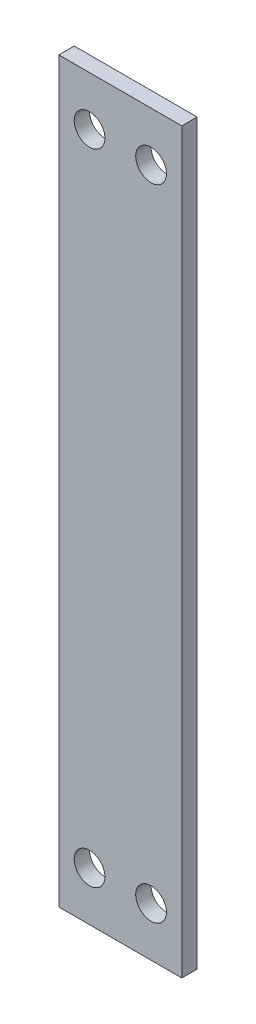
ISO-10303-21;
HEADER;
FILE_DESCRIPTION(('STEP AP214'),'2;1');
FILE_NAME('part.step','',(''),(''),'','','');
FILE_SCHEMA(('AUTOMOTIVE_DESIGN { 1 0 10303 214 1 1 1 1 }'));
ENDSEC;
DATA;
#1=APPLICATION_CONTEXT('core data for automotive mechanical design processes');
#2=APPLICATION_PROTOCOL_DEFINITION('international standard','automotive_design',2000,#1);
#3=PRODUCT_CONTEXT('',#1,'mechanical');
#4=PRODUCT('Part','Part','',(#3));
#5=PRODUCT_RELATED_PRODUCT_CATEGORY('part','',(#4));
#6=PRODUCT_DEFINITION_FORMATION('','',#4);
#7=PRODUCT_DEFINITION_CONTEXT('part definition',#1,'design');
#8=PRODUCT_DEFINITION('design','',#6,#7);
#9=PRODUCT_DEFINITION_SHAPE('','',#8);
#10=(LENGTH_UNIT() NAMED_UNIT(*) SI_UNIT(.MILLI.,.METRE.));
#11=(NAMED_UNIT(*) PLANE_ANGLE_UNIT() SI_UNIT($,.RADIAN.));
#12=(NAMED_UNIT(*) SI_UNIT($,.STERADIAN.) SOLID_ANGLE_UNIT());
#13=UNCERTAINTY_MEASURE_WITH_UNIT(LENGTH_MEASURE(1.E-05),#10,'distance_accuracy_value','');
#14=(GEOMETRIC_REPRESENTATION_CONTEXT(3) GLOBAL_UNCERTAINTY_ASSIGNED_CONTEXT((#13)) GLOBAL_UNIT_ASSIGNED_CONTEXT((#10,
#11,#12)) REPRESENTATION_CONTEXT('',''));
#15=CARTESIAN_POINT('',(0.,0.,0.));
#16=DIRECTION('',(0.,0.,1.));
#17=DIRECTION('',(1.,0.,0.));
#18=AXIS2_PLACEMENT_3D('',#15,#16,#17);
#19=CARTESIAN_POINT('',(0.,0.,4.7625));
#20=DIRECTION('',(0.,0.,-1.));
#21=DIRECTION('',(-1.,0.,0.));
#22=AXIS2_PLACEMENT_3D('',#19,#20,#21);
#23=PLANE('',#22);
#24=DIRECTION('',(0.,-1.,0.));
#25=VECTOR('',#24,1.);
#26=CARTESIAN_POINT('',(0.,0.,4.7625));
#27=LINE('',#26,#25);
#28=CARTESIAN_POINT('',(0.,228.6,4.7625));
#29=VERTEX_POINT('',#28);
#30=CARTESIAN_POINT('',(0.,0.,4.7625));
#31=VERTEX_POINT('',#30);
#32=EDGE_CURVE('E96',#29,#31,#27,.T.);
#33=ORIENTED_EDGE('',*,*,#32,.T.);
#34=DIRECTION('',(1.,0.,0.));
#35=VECTOR('',#34,1.);
#36=CARTESIAN_POINT('',(0.,0.,4.7625));
#37=LINE('',#36,#35);
#38=CARTESIAN_POINT('',(38.1,0.,4.7625));
#39=VERTEX_POINT('',#38);
#40=EDGE_CURVE('E91',#31,#39,#37,.T.);
#41=ORIENTED_EDGE('',*,*,#40,.T.);
#42=DIRECTION('',(0.,1.,0.));
#43=VECTOR('',#42,1.);
#44=CARTESIAN_POINT('',(38.1,0.,4.7625));
#45=LINE('',#44,#43);
#46=CARTESIAN_POINT('',(38.1,228.6,4.7625));
#47=VERTEX_POINT('',#46);
#48=EDGE_CURVE('E94',#39,#47,#45,.T.);
#49=ORIENTED_EDGE('',*,*,#48,.T.);
#50=DIRECTION('',(-1.,0.,0.));
#51=VECTOR('',#50,1.);
#52=CARTESIAN_POINT('',(0.,228.6,4.7625));
#53=LINE('',#52,#51);
#54=EDGE_CURVE('E61',#47,#29,#53,.T.);
#55=ORIENTED_EDGE('',*,*,#54,.T.);
#56=EDGE_LOOP('',(#33,#41,#49,#55));
#57=FACE_BOUND('',#56,.T.);
#58=CARTESIAN_POINT('',(9.525,15.24,4.7625));
#59=DIRECTION('',(0.,0.,1.));
#60=DIRECTION('',(1.,0.,0.));
#61=AXIS2_PLACEMENT_3D('',#58,#59,#60);
#62=CIRCLE('',#61,4.7625);
#63=CARTESIAN_POINT('',(4.7625,15.24,4.7625));
#64=VERTEX_POINT('',#63);
#65=EDGE_CURVE('E116',#64,#64,#62,.T.);
#66=ORIENTED_EDGE('',*,*,#65,.F.);
#67=EDGE_LOOP('',(#66));
#68=FACE_BOUND('',#67,.T.);
#69=CARTESIAN_POINT('',(28.575,15.24,4.7625));
#70=DIRECTION('',(0.,0.,1.));
#71=DIRECTION('',(1.,0.,0.));
#72=AXIS2_PLACEMENT_3D('',#69,#70,#71);
#73=CIRCLE('',#72,4.7625);
#74=CARTESIAN_POINT('',(23.8125,15.24,4.7625));
#75=VERTEX_POINT('',#74);
#76=EDGE_CURVE('E138',#75,#75,#73,.T.);
#77=ORIENTED_EDGE('',*,*,#76,.F.);
#78=EDGE_LOOP('',(#77));
#79=FACE_BOUND('',#78,.T.);
#80=CARTESIAN_POINT('',(9.525,213.36,4.7625));
#81=DIRECTION('',(0.,0.,1.));
#82=DIRECTION('',(1.,0.,0.));
#83=AXIS2_PLACEMENT_3D('',#80,#81,#82);
#84=CIRCLE('',#83,4.7625);
#85=CARTESIAN_POINT('',(4.76250000000001,213.36,4.7625));
#86=VERTEX_POINT('',#85);
#87=EDGE_CURVE('E146',#86,#86,#84,.T.);
#88=ORIENTED_EDGE('',*,*,#87,.F.);
#89=EDGE_LOOP('',(#88));
#90=FACE_BOUND('',#89,.T.);
#91=CARTESIAN_POINT('',(28.575,213.36,4.7625));
#92=DIRECTION('',(0.,0.,1.));
#93=DIRECTION('',(1.,0.,0.));
#94=AXIS2_PLACEMENT_3D('',#91,#92,#93);
#95=CIRCLE('',#94,4.7625);
#96=CARTESIAN_POINT('',(23.8125,213.36,4.7625));
#97=VERTEX_POINT('',#96);
#98=EDGE_CURVE('E154',#97,#97,#95,.T.);
#99=ORIENTED_EDGE('',*,*,#98,.F.);
#100=EDGE_LOOP('',(#99));
#101=FACE_BOUND('',#100,.T.);
#102=ADVANCED_FACE('F43',(#57,#68,#79,#90,#101),#23,.F.);
#103=CARTESIAN_POINT('',(0.,0.,0.));
#104=DIRECTION('',(0.,0.,-1.));
#105=DIRECTION('',(-1.,0.,0.));
#106=AXIS2_PLACEMENT_3D('',#103,#104,#105);
#107=PLANE('',#106);
#108=CARTESIAN_POINT('',(9.525,213.36,0.));
#109=DIRECTION('',(0.,0.,1.));
#110=DIRECTION('',(1.,0.,0.));
#111=AXIS2_PLACEMENT_3D('',#108,#109,#110);
#112=CIRCLE('',#111,4.7625);
#113=CARTESIAN_POINT('',(4.76250000000001,213.36,0.));
#114=VERTEX_POINT('',#113);
#115=EDGE_CURVE('E150',#114,#114,#112,.T.);
#116=ORIENTED_EDGE('',*,*,#115,.T.);
#117=EDGE_LOOP('',(#116));
#118=FACE_BOUND('',#117,.T.);
#119=CARTESIAN_POINT('',(9.525,15.24,0.));
#120=DIRECTION('',(0.,0.,1.));
#121=DIRECTION('',(1.,0.,0.));
#122=AXIS2_PLACEMENT_3D('',#119,#120,#121);
#123=CIRCLE('',#122,4.7625);
#124=CARTESIAN_POINT('',(4.7625,15.24,0.));
#125=VERTEX_POINT('',#124);
#126=EDGE_CURVE('E134',#125,#125,#123,.T.);
#127=ORIENTED_EDGE('',*,*,#126,.T.);
#128=EDGE_LOOP('',(#127));
#129=FACE_BOUND('',#128,.T.);
#130=DIRECTION('',(0.,-1.,0.));
#131=VECTOR('',#130,1.);
#132=CARTESIAN_POINT('',(0.,0.,0.));
#133=LINE('',#132,#131);
#134=CARTESIAN_POINT('',(0.,228.6,0.));
#135=VERTEX_POINT('',#134);
#136=CARTESIAN_POINT('',(0.,0.,0.));
#137=VERTEX_POINT('',#136);
#138=EDGE_CURVE('E112',#135,#137,#133,.T.);
#139=ORIENTED_EDGE('',*,*,#138,.F.);
#140=DIRECTION('',(-1.,0.,0.));
#141=VECTOR('',#140,1.);
#142=CARTESIAN_POINT('',(0.,228.6,0.));
#143=LINE('',#142,#141);
#144=CARTESIAN_POINT('',(38.1,228.6,0.));
#145=VERTEX_POINT('',#144);
#146=EDGE_CURVE('E84',#145,#135,#143,.T.);
#147=ORIENTED_EDGE('',*,*,#146,.F.);
#148=DIRECTION('',(0.,1.,0.));
#149=VECTOR('',#148,1.);
#150=CARTESIAN_POINT('',(38.1,0.,0.));
#151=LINE('',#150,#149);
#152=CARTESIAN_POINT('',(38.1,0.,0.));
#153=VERTEX_POINT('',#152);
#154=EDGE_CURVE('E78',#153,#145,#151,.T.);
#155=ORIENTED_EDGE('',*,*,#154,.F.);
#156=DIRECTION('',(1.,0.,0.));
#157=VECTOR('',#156,1.);
#158=CARTESIAN_POINT('',(0.,0.,0.));
#159=LINE('',#158,#157);
#160=EDGE_CURVE('E101',#137,#153,#159,.T.);
#161=ORIENTED_EDGE('',*,*,#160,.F.);
#162=EDGE_LOOP('',(#139,#147,#155,#161));
#163=FACE_BOUND('',#162,.T.);
#164=CARTESIAN_POINT('',(28.575,15.24,0.));
#165=DIRECTION('',(0.,0.,1.));
#166=DIRECTION('',(1.,0.,0.));
#167=AXIS2_PLACEMENT_3D('',#164,#165,#166);
#168=CIRCLE('',#167,4.7625);
#169=CARTESIAN_POINT('',(23.8125,15.24,0.));
#170=VERTEX_POINT('',#169);
#171=EDGE_CURVE('E142',#170,#170,#168,.T.);
#172=ORIENTED_EDGE('',*,*,#171,.T.);
#173=EDGE_LOOP('',(#172));
#174=FACE_BOUND('',#173,.T.);
#175=CARTESIAN_POINT('',(28.575,213.36,0.));
#176=DIRECTION('',(0.,0.,1.));
#177=DIRECTION('',(1.,0.,0.));
#178=AXIS2_PLACEMENT_3D('',#175,#176,#177);
#179=CIRCLE('',#178,4.7625);
#180=CARTESIAN_POINT('',(23.8125,213.36,0.));
#181=VERTEX_POINT('',#180);
#182=EDGE_CURVE('E158',#181,#181,#179,.T.);
#183=ORIENTED_EDGE('',*,*,#182,.T.);
#184=EDGE_LOOP('',(#183));
#185=FACE_BOUND('',#184,.T.);
#186=ADVANCED_FACE('F129',(#118,#129,#163,#174,#185),#107,.T.);
#187=CARTESIAN_POINT('',(0.,0.,4.7625));
#188=DIRECTION('',(1.,0.,0.));
#189=DIRECTION('',(0.,0.,-1.));
#190=AXIS2_PLACEMENT_3D('',#187,#188,#189);
#191=PLANE('',#190);
#192=ORIENTED_EDGE('',*,*,#138,.T.);
#193=DIRECTION('',(0.,0.,-1.));
#194=VECTOR('',#193,1.);
#195=CARTESIAN_POINT('',(0.,0.,4.7625));
#196=LINE('',#195,#194);
#197=EDGE_CURVE('E11',#31,#137,#196,.T.);
#198=ORIENTED_EDGE('',*,*,#197,.F.);
#199=ORIENTED_EDGE('',*,*,#32,.F.);
#200=DIRECTION('',(0.,0.,-1.));
#201=VECTOR('',#200,1.);
#202=CARTESIAN_POINT('',(0.,228.6,4.7625));
#203=LINE('',#202,#201);
#204=EDGE_CURVE('E108',#29,#135,#203,.T.);
#205=ORIENTED_EDGE('',*,*,#204,.T.);
#206=EDGE_LOOP('',(#192,#198,#199,#205));
#207=FACE_BOUND('',#206,.T.);
#208=ADVANCED_FACE('F45',(#207),#191,.F.);
#209=CARTESIAN_POINT('',(0.,0.,4.7625));
#210=DIRECTION('',(0.,1.,0.));
#211=DIRECTION('',(0.,0.,1.));
#212=AXIS2_PLACEMENT_3D('',#209,#210,#211);
#213=PLANE('',#212);
#214=ORIENTED_EDGE('',*,*,#160,.T.);
#215=DIRECTION('',(0.,0.,-1.));
#216=VECTOR('',#215,1.);
#217=CARTESIAN_POINT('',(38.1,0.,4.7625));
#218=LINE('',#217,#216);
#219=EDGE_CURVE('E53',#39,#153,#218,.T.);
#220=ORIENTED_EDGE('',*,*,#219,.F.);
#221=ORIENTED_EDGE('',*,*,#40,.F.);
#222=ORIENTED_EDGE('',*,*,#197,.T.);
#223=EDGE_LOOP('',(#214,#220,#221,#222));
#224=FACE_BOUND('',#223,.T.);
#225=ADVANCED_FACE('F100',(#224),#213,.F.);
#226=CARTESIAN_POINT('',(38.1,0.,4.7625));
#227=DIRECTION('',(-1.,0.,0.));
#228=DIRECTION('',(0.,0.,1.));
#229=AXIS2_PLACEMENT_3D('',#226,#227,#228);
#230=PLANE('',#229);
#231=ORIENTED_EDGE('',*,*,#154,.T.);
#232=DIRECTION('',(0.,0.,-1.));
#233=VECTOR('',#232,1.);
#234=CARTESIAN_POINT('',(38.1,228.6,4.7625));
#235=LINE('',#234,#233);
#236=EDGE_CURVE('E103',#47,#145,#235,.T.);
#237=ORIENTED_EDGE('',*,*,#236,.F.);
#238=ORIENTED_EDGE('',*,*,#48,.F.);
#239=ORIENTED_EDGE('',*,*,#219,.T.);
#240=EDGE_LOOP('',(#231,#237,#238,#239));
#241=FACE_BOUND('',#240,.T.);
#242=ADVANCED_FACE('F104',(#241),#230,.F.);
#243=CARTESIAN_POINT('',(0.,228.6,4.7625));
#244=DIRECTION('',(0.,-1.,0.));
#245=DIRECTION('',(0.,0.,-1.));
#246=AXIS2_PLACEMENT_3D('',#243,#244,#245);
#247=PLANE('',#246);
#248=ORIENTED_EDGE('',*,*,#146,.T.);
#249=ORIENTED_EDGE('',*,*,#204,.F.);
#250=ORIENTED_EDGE('',*,*,#54,.F.);
#251=ORIENTED_EDGE('',*,*,#236,.T.);
#252=EDGE_LOOP('',(#248,#249,#250,#251));
#253=FACE_BOUND('',#252,.T.);
#254=ADVANCED_FACE('F126',(#253),#247,.F.);
#255=CARTESIAN_POINT('',(9.525,15.24,4.7625));
#256=DIRECTION('',(0.,0.,-1.));
#257=DIRECTION('',(-1.,0.,0.));
#258=AXIS2_PLACEMENT_3D('',#255,#256,#257);
#259=CYLINDRICAL_SURFACE('',#258,4.7625);
#260=CARTESIAN_POINT('',(4.7625,15.24,4.7625));
#261=CARTESIAN_POINT('',(4.7625,15.24,4.712890625));
#262=CARTESIAN_POINT('',(4.7625,15.24,4.66328125));
#263=CARTESIAN_POINT('',(4.7625,15.24,4.5640625));
#264=CARTESIAN_POINT('',(4.7625,15.24,4.514453125));
#265=CARTESIAN_POINT('',(4.7625,15.24,4.415234375));
#266=CARTESIAN_POINT('',(4.7625,15.24,4.365625));
#267=CARTESIAN_POINT('',(4.7625,15.24,4.26640625));
#268=CARTESIAN_POINT('',(4.7625,15.24,4.216796875));
#269=CARTESIAN_POINT('',(4.7625,15.24,4.117578125));
#270=CARTESIAN_POINT('',(4.7625,15.24,4.06796875));
#271=CARTESIAN_POINT('',(4.7625,15.24,3.96875));
#272=CARTESIAN_POINT('',(4.7625,15.24,3.919140625));
#273=CARTESIAN_POINT('',(4.7625,15.24,3.819921875));
#274=CARTESIAN_POINT('',(4.7625,15.24,3.7703125));
#275=CARTESIAN_POINT('',(4.7625,15.24,3.67109375));
#276=CARTESIAN_POINT('',(4.7625,15.24,3.621484375));
#277=CARTESIAN_POINT('',(4.7625,15.24,3.522265625));
#278=CARTESIAN_POINT('',(4.7625,15.24,3.47265625));
#279=CARTESIAN_POINT('',(4.7625,15.24,3.3734375));
#280=CARTESIAN_POINT('',(4.7625,15.24,3.323828125));
#281=CARTESIAN_POINT('',(4.7625,15.24,3.224609375));
#282=CARTESIAN_POINT('',(4.7625,15.24,3.175));
#283=CARTESIAN_POINT('',(4.7625,15.24,3.07578125));
#284=CARTESIAN_POINT('',(4.7625,15.24,3.026171875));
#285=CARTESIAN_POINT('',(4.7625,15.24,2.926953125));
#286=CARTESIAN_POINT('',(4.7625,15.24,2.87734375));
#287=CARTESIAN_POINT('',(4.7625,15.24,2.778125));
#288=CARTESIAN_POINT('',(4.7625,15.24,2.728515625));
#289=CARTESIAN_POINT('',(4.7625,15.24,2.629296875));
#290=CARTESIAN_POINT('',(4.7625,15.24,2.5796875));
#291=CARTESIAN_POINT('',(4.7625,15.24,2.48046875));
#292=CARTESIAN_POINT('',(4.7625,15.24,2.430859375));
#293=CARTESIAN_POINT('',(4.7625,15.24,2.331640625));
#294=CARTESIAN_POINT('',(4.7625,15.24,2.28203125));
#295=CARTESIAN_POINT('',(4.7625,15.24,2.1828125));
#296=CARTESIAN_POINT('',(4.7625,15.24,2.133203125));
#297=CARTESIAN_POINT('',(4.7625,15.24,2.033984375));
#298=CARTESIAN_POINT('',(4.7625,15.24,1.984375));
#299=CARTESIAN_POINT('',(4.7625,15.24,1.88515625));
#300=CARTESIAN_POINT('',(4.7625,15.24,1.835546875));
#301=CARTESIAN_POINT('',(4.7625,15.24,1.736328125));
#302=CARTESIAN_POINT('',(4.7625,15.24,1.68671875));
#303=CARTESIAN_POINT('',(4.7625,15.24,1.5875));
#304=CARTESIAN_POINT('',(4.7625,15.24,1.537890625));
#305=CARTESIAN_POINT('',(4.7625,15.24,1.438671875));
#306=CARTESIAN_POINT('',(4.7625,15.24,1.3890625));
#307=CARTESIAN_POINT('',(4.7625,15.24,1.28984375));
#308=CARTESIAN_POINT('',(4.7625,15.24,1.240234375));
#309=CARTESIAN_POINT('',(4.7625,15.24,1.141015625));
#310=CARTESIAN_POINT('',(4.7625,15.24,1.09140625));
#311=CARTESIAN_POINT('',(4.7625,15.24,0.992187499999999));
#312=CARTESIAN_POINT('',(4.7625,15.24,0.942578124999999));
#313=CARTESIAN_POINT('',(4.7625,15.24,0.843359375));
#314=CARTESIAN_POINT('',(4.7625,15.24,0.79375));
#315=CARTESIAN_POINT('',(4.7625,15.24,0.69453125));
#316=CARTESIAN_POINT('',(4.7625,15.24,0.644921875));
#317=CARTESIAN_POINT('',(4.7625,15.24,0.545703125));
#318=CARTESIAN_POINT('',(4.7625,15.24,0.49609375));
#319=CARTESIAN_POINT('',(4.7625,15.24,0.396875));
#320=CARTESIAN_POINT('',(4.7625,15.24,0.347265625));
#321=CARTESIAN_POINT('',(4.7625,15.24,0.248046875));
#322=CARTESIAN_POINT('',(4.7625,15.24,0.1984375));
#323=CARTESIAN_POINT('',(4.7625,15.24,0.09921875));
#324=CARTESIAN_POINT('',(4.7625,15.24,0.049609375));
#325=CARTESIAN_POINT('',(4.7625,15.24,0.));
#326=B_SPLINE_CURVE_WITH_KNOTS('',3,(#260,#261,#262,#263,#264,#265,#266,#267,#268,#269,#270,
#271,#272,#273,#274,#275,#276,#277,#278,#279,#280,#281,#282,#283,#284,#285,#286,#287,#288,#289,
#290,#291,#292,#293,#294,#295,#296,#297,#298,#299,#300,#301,#302,#303,#304,#305,#306,#307,#308,
#309,#310,#311,#312,#313,#314,#315,#316,#317,#318,#319,#320,#321,#322,#323,#324,#325),
.UNSPECIFIED.,.F.,.F.,(4,2,2,2,2,2,2,2,2,2,2,2,2,2,2,2,2,2,2,2,2,2,2,2,2,2,2,2,2,2,2,2,4),(0.,
0.148828125,0.29765625,0.446484375,0.5953125,0.744140625,0.892968750000001,1.041796875,1.190625,
1.339453125,1.48828125,1.637109375,1.7859375,1.934765625,2.08359375,2.232421875,2.38125,
2.530078125,2.67890625,2.827734375,2.9765625,3.125390625,3.27421875,3.423046875,3.571875,
3.720703125,3.86953125,4.018359375,4.1671875,4.316015625,4.46484375,4.613671875,4.7625),.UNSPECIFIED.);
#327=EDGE_CURVE('BSEAM177',#64,#125,#326,.T.);
#328=ORIENTED_EDGE('',*,*,#65,.T.);
#329=ORIENTED_EDGE('',*,*,#126,.F.);
#330=ORIENTED_EDGE('',*,*,#327,.T.);
#331=ORIENTED_EDGE('',*,*,#327,.F.);
#332=EDGE_LOOP('',(#328,#330,#329,#331));
#333=FACE_BOUND('',#332,.T.);
#334=ADVANCED_FACE('F177',(#333),#259,.F.);
#335=CARTESIAN_POINT('',(28.575,15.24,4.7625));
#336=DIRECTION('',(0.,0.,-1.));
#337=DIRECTION('',(-1.,0.,0.));
#338=AXIS2_PLACEMENT_3D('',#335,#336,#337);
#339=CYLINDRICAL_SURFACE('',#338,4.7625);
#340=CARTESIAN_POINT('',(23.8125,15.24,4.7625));
#341=CARTESIAN_POINT('',(23.8125,15.24,4.712890625));
#342=CARTESIAN_POINT('',(23.8125,15.24,4.66328125));
#343=CARTESIAN_POINT('',(23.8125,15.24,4.5640625));
#344=CARTESIAN_POINT('',(23.8125,15.24,4.514453125));
#345=CARTESIAN_POINT('',(23.8125,15.24,4.415234375));
#346=CARTESIAN_POINT('',(23.8125,15.24,4.365625));
#347=CARTESIAN_POINT('',(23.8125,15.24,4.26640625));
#348=CARTESIAN_POINT('',(23.8125,15.24,4.216796875));
#349=CARTESIAN_POINT('',(23.8125,15.24,4.117578125));
#350=CARTESIAN_POINT('',(23.8125,15.24,4.06796875));
#351=CARTESIAN_POINT('',(23.8125,15.24,3.96875));
#352=CARTESIAN_POINT('',(23.8125,15.24,3.919140625));
#353=CARTESIAN_POINT('',(23.8125,15.24,3.819921875));
#354=CARTESIAN_POINT('',(23.8125,15.24,3.7703125));
#355=CARTESIAN_POINT('',(23.8125,15.24,3.67109375));
#356=CARTESIAN_POINT('',(23.8125,15.24,3.621484375));
#357=CARTESIAN_POINT('',(23.8125,15.24,3.522265625));
#358=CARTESIAN_POINT('',(23.8125,15.24,3.47265625));
#359=CARTESIAN_POINT('',(23.8125,15.24,3.3734375));
#360=CARTESIAN_POINT('',(23.8125,15.24,3.323828125));
#361=CARTESIAN_POINT('',(23.8125,15.24,3.224609375));
#362=CARTESIAN_POINT('',(23.8125,15.24,3.175));
#363=CARTESIAN_POINT('',(23.8125,15.24,3.07578125));
#364=CARTESIAN_POINT('',(23.8125,15.24,3.026171875));
#365=CARTESIAN_POINT('',(23.8125,15.24,2.926953125));
#366=CARTESIAN_POINT('',(23.8125,15.24,2.87734375));
#367=CARTESIAN_POINT('',(23.8125,15.24,2.778125));
#368=CARTESIAN_POINT('',(23.8125,15.24,2.728515625));
#369=CARTESIAN_POINT('',(23.8125,15.24,2.629296875));
#370=CARTESIAN_POINT('',(23.8125,15.24,2.5796875));
#371=CARTESIAN_POINT('',(23.8125,15.24,2.48046875));
#372=CARTESIAN_POINT('',(23.8125,15.24,2.430859375));
#373=CARTESIAN_POINT('',(23.8125,15.24,2.331640625));
#374=CARTESIAN_POINT('',(23.8125,15.24,2.28203125));
#375=CARTESIAN_POINT('',(23.8125,15.24,2.1828125));
#376=CARTESIAN_POINT('',(23.8125,15.24,2.133203125));
#377=CARTESIAN_POINT('',(23.8125,15.24,2.033984375));
#378=CARTESIAN_POINT('',(23.8125,15.24,1.984375));
#379=CARTESIAN_POINT('',(23.8125,15.24,1.88515625));
#380=CARTESIAN_POINT('',(23.8125,15.24,1.835546875));
#381=CARTESIAN_POINT('',(23.8125,15.24,1.736328125));
#382=CARTESIAN_POINT('',(23.8125,15.24,1.68671875));
#383=CARTESIAN_POINT('',(23.8125,15.24,1.5875));
#384=CARTESIAN_POINT('',(23.8125,15.24,1.537890625));
#385=CARTESIAN_POINT('',(23.8125,15.24,1.438671875));
#386=CARTESIAN_POINT('',(23.8125,15.24,1.3890625));
#387=CARTESIAN_POINT('',(23.8125,15.24,1.28984375));
#388=CARTESIAN_POINT('',(23.8125,15.24,1.240234375));
#389=CARTESIAN_POINT('',(23.8125,15.24,1.141015625));
#390=CARTESIAN_POINT('',(23.8125,15.24,1.09140625));
#391=CARTESIAN_POINT('',(23.8125,15.24,0.992187499999999));
#392=CARTESIAN_POINT('',(23.8125,15.24,0.942578124999999));
#393=CARTESIAN_POINT('',(23.8125,15.24,0.843359375));
#394=CARTESIAN_POINT('',(23.8125,15.24,0.79375));
#395=CARTESIAN_POINT('',(23.8125,15.24,0.69453125));
#396=CARTESIAN_POINT('',(23.8125,15.24,0.644921875));
#397=CARTESIAN_POINT('',(23.8125,15.24,0.545703125));
#398=CARTESIAN_POINT('',(23.8125,15.24,0.49609375));
#399=CARTESIAN_POINT('',(23.8125,15.24,0.396875));
#400=CARTESIAN_POINT('',(23.8125,15.24,0.347265625));
#401=CARTESIAN_POINT('',(23.8125,15.24,0.248046875));
#402=CARTESIAN_POINT('',(23.8125,15.24,0.1984375));
#403=CARTESIAN_POINT('',(23.8125,15.24,0.09921875));
#404=CARTESIAN_POINT('',(23.8125,15.24,0.049609375));
#405=CARTESIAN_POINT('',(23.8125,15.24,0.));
#406=B_SPLINE_CURVE_WITH_KNOTS('',3,(#340,#341,#342,#343,#344,#345,#346,#347,#348,#349,#350,
#351,#352,#353,#354,#355,#356,#357,#358,#359,#360,#361,#362,#363,#364,#365,#366,#367,#368,#369,
#370,#371,#372,#373,#374,#375,#376,#377,#378,#379,#380,#381,#382,#383,#384,#385,#386,#387,#388,
#389,#390,#391,#392,#393,#394,#395,#396,#397,#398,#399,#400,#401,#402,#403,#404,#405),
.UNSPECIFIED.,.F.,.F.,(4,2,2,2,2,2,2,2,2,2,2,2,2,2,2,2,2,2,2,2,2,2,2,2,2,2,2,2,2,2,2,2,4),(0.,
0.148828125,0.29765625,0.446484375,0.5953125,0.744140625,0.892968750000001,1.041796875,1.190625,
1.339453125,1.48828125,1.637109375,1.7859375,1.934765625,2.08359375,2.232421875,2.38125,
2.530078125,2.67890625,2.827734375,2.9765625,3.125390625,3.27421875,3.423046875,3.571875,
3.720703125,3.86953125,4.018359375,4.1671875,4.316015625,4.46484375,4.613671875,4.7625),.UNSPECIFIED.);
#407=EDGE_CURVE('BSEAM231',#75,#170,#406,.T.);
#408=ORIENTED_EDGE('',*,*,#76,.T.);
#409=ORIENTED_EDGE('',*,*,#171,.F.);
#410=ORIENTED_EDGE('',*,*,#407,.T.);
#411=ORIENTED_EDGE('',*,*,#407,.F.);
#412=EDGE_LOOP('',(#408,#410,#409,#411));
#413=FACE_BOUND('',#412,.T.);
#414=ADVANCED_FACE('F231',(#413),#339,.F.);
#415=CARTESIAN_POINT('',(9.525,213.36,4.7625));
#416=DIRECTION('',(0.,0.,-1.));
#417=DIRECTION('',(-1.,0.,0.));
#418=AXIS2_PLACEMENT_3D('',#415,#416,#417);
#419=CYLINDRICAL_SURFACE('',#418,4.7625);
#420=CARTESIAN_POINT('',(4.76250000000001,213.36,4.7625));
#421=CARTESIAN_POINT('',(4.76250000000001,213.36,4.712890625));
#422=CARTESIAN_POINT('',(4.76250000000001,213.36,4.66328125));
#423=CARTESIAN_POINT('',(4.76250000000001,213.36,4.5640625));
#424=CARTESIAN_POINT('',(4.76250000000001,213.36,4.514453125));
#425=CARTESIAN_POINT('',(4.76250000000001,213.36,4.415234375));
#426=CARTESIAN_POINT('',(4.76250000000001,213.36,4.365625));
#427=CARTESIAN_POINT('',(4.76250000000001,213.36,4.26640625));
#428=CARTESIAN_POINT('',(4.76250000000001,213.36,4.216796875));
#429=CARTESIAN_POINT('',(4.76250000000001,213.36,4.117578125));
#430=CARTESIAN_POINT('',(4.76250000000001,213.36,4.06796875));
#431=CARTESIAN_POINT('',(4.76250000000001,213.36,3.96875));
#432=CARTESIAN_POINT('',(4.76250000000001,213.36,3.919140625));
#433=CARTESIAN_POINT('',(4.76250000000001,213.36,3.819921875));
#434=CARTESIAN_POINT('',(4.76250000000001,213.36,3.7703125));
#435=CARTESIAN_POINT('',(4.76250000000001,213.36,3.67109375));
#436=CARTESIAN_POINT('',(4.76250000000001,213.36,3.621484375));
#437=CARTESIAN_POINT('',(4.76250000000001,213.36,3.522265625));
#438=CARTESIAN_POINT('',(4.76250000000001,213.36,3.47265625));
#439=CARTESIAN_POINT('',(4.76250000000001,213.36,3.3734375));
#440=CARTESIAN_POINT('',(4.76250000000001,213.36,3.323828125));
#441=CARTESIAN_POINT('',(4.76250000000001,213.36,3.224609375));
#442=CARTESIAN_POINT('',(4.76250000000001,213.36,3.175));
#443=CARTESIAN_POINT('',(4.76250000000001,213.36,3.07578125));
#444=CARTESIAN_POINT('',(4.76250000000001,213.36,3.026171875));
#445=CARTESIAN_POINT('',(4.76250000000001,213.36,2.926953125));
#446=CARTESIAN_POINT('',(4.76250000000001,213.36,2.87734375));
#447=CARTESIAN_POINT('',(4.76250000000001,213.36,2.778125));
#448=CARTESIAN_POINT('',(4.76250000000001,213.36,2.728515625));
#449=CARTESIAN_POINT('',(4.76250000000001,213.36,2.629296875));
#450=CARTESIAN_POINT('',(4.76250000000001,213.36,2.5796875));
#451=CARTESIAN_POINT('',(4.76250000000001,213.36,2.48046875));
#452=CARTESIAN_POINT('',(4.76250000000001,213.36,2.430859375));
#453=CARTESIAN_POINT('',(4.76250000000001,213.36,2.331640625));
#454=CARTESIAN_POINT('',(4.76250000000001,213.36,2.28203125));
#455=CARTESIAN_POINT('',(4.76250000000001,213.36,2.1828125));
#456=CARTESIAN_POINT('',(4.76250000000001,213.36,2.133203125));
#457=CARTESIAN_POINT('',(4.76250000000001,213.36,2.033984375));
#458=CARTESIAN_POINT('',(4.76250000000001,213.36,1.984375));
#459=CARTESIAN_POINT('',(4.76250000000001,213.36,1.88515625));
#460=CARTESIAN_POINT('',(4.76250000000001,213.36,1.835546875));
#461=CARTESIAN_POINT('',(4.76250000000001,213.36,1.736328125));
#462=CARTESIAN_POINT('',(4.76250000000001,213.36,1.68671875));
#463=CARTESIAN_POINT('',(4.76250000000001,213.36,1.5875));
#464=CARTESIAN_POINT('',(4.76250000000001,213.36,1.537890625));
#465=CARTESIAN_POINT('',(4.76250000000001,213.36,1.438671875));
#466=CARTESIAN_POINT('',(4.76250000000001,213.36,1.3890625));
#467=CARTESIAN_POINT('',(4.76250000000001,213.36,1.28984375));
#468=CARTESIAN_POINT('',(4.76250000000001,213.36,1.240234375));
#469=CARTESIAN_POINT('',(4.76250000000001,213.36,1.141015625));
#470=CARTESIAN_POINT('',(4.76250000000001,213.36,1.09140625));
#471=CARTESIAN_POINT('',(4.76250000000001,213.36,0.992187499999999));
#472=CARTESIAN_POINT('',(4.76250000000001,213.36,0.942578124999999));
#473=CARTESIAN_POINT('',(4.76250000000001,213.36,0.843359375));
#474=CARTESIAN_POINT('',(4.76250000000001,213.36,0.79375));
#475=CARTESIAN_POINT('',(4.76250000000001,213.36,0.69453125));
#476=CARTESIAN_POINT('',(4.76250000000001,213.36,0.644921875));
#477=CARTESIAN_POINT('',(4.76250000000001,213.36,0.545703125));
#478=CARTESIAN_POINT('',(4.76250000000001,213.36,0.49609375));
#479=CARTESIAN_POINT('',(4.76250000000001,213.36,0.396875));
#480=CARTESIAN_POINT('',(4.76250000000001,213.36,0.347265625));
#481=CARTESIAN_POINT('',(4.76250000000001,213.36,0.248046875));
#482=CARTESIAN_POINT('',(4.76250000000001,213.36,0.1984375));
#483=CARTESIAN_POINT('',(4.76250000000001,213.36,0.09921875));
#484=CARTESIAN_POINT('',(4.76250000000001,213.36,0.049609375));
#485=CARTESIAN_POINT('',(4.76250000000001,213.36,0.));
#486=B_SPLINE_CURVE_WITH_KNOTS('',3,(#420,#421,#422,#423,#424,#425,#426,#427,#428,#429,#430,
#431,#432,#433,#434,#435,#436,#437,#438,#439,#440,#441,#442,#443,#444,#445,#446,#447,#448,#449,
#450,#451,#452,#453,#454,#455,#456,#457,#458,#459,#460,#461,#462,#463,#464,#465,#466,#467,#468,
#469,#470,#471,#472,#473,#474,#475,#476,#477,#478,#479,#480,#481,#482,#483,#484,#485),
.UNSPECIFIED.,.F.,.F.,(4,2,2,2,2,2,2,2,2,2,2,2,2,2,2,2,2,2,2,2,2,2,2,2,2,2,2,2,2,2,2,2,4),(0.,
0.148828125,0.29765625,0.446484375,0.5953125,0.744140625,0.892968750000001,1.041796875,1.190625,
1.339453125,1.48828125,1.637109375,1.7859375,1.934765625,2.08359375,2.232421875,2.38125,
2.530078125,2.67890625,2.827734375,2.9765625,3.125390625,3.27421875,3.423046875,3.571875,
3.720703125,3.86953125,4.018359375,4.1671875,4.316015625,4.46484375,4.613671875,4.7625),.UNSPECIFIED.);
#487=EDGE_CURVE('BSEAM240',#86,#114,#486,.T.);
#488=ORIENTED_EDGE('',*,*,#87,.T.);
#489=ORIENTED_EDGE('',*,*,#115,.F.);
#490=ORIENTED_EDGE('',*,*,#487,.T.);
#491=ORIENTED_EDGE('',*,*,#487,.F.);
#492=EDGE_LOOP('',(#488,#490,#489,#491));
#493=FACE_BOUND('',#492,.T.);
#494=ADVANCED_FACE('F240',(#493),#419,.F.);
#495=CARTESIAN_POINT('',(28.575,213.36,4.7625));
#496=DIRECTION('',(0.,0.,-1.));
#497=DIRECTION('',(-1.,0.,0.));
#498=AXIS2_PLACEMENT_3D('',#495,#496,#497);
#499=CYLINDRICAL_SURFACE('',#498,4.7625);
#500=CARTESIAN_POINT('',(23.8125,213.36,4.7625));
#501=CARTESIAN_POINT('',(23.8125,213.36,4.712890625));
#502=CARTESIAN_POINT('',(23.8125,213.36,4.66328125));
#503=CARTESIAN_POINT('',(23.8125,213.36,4.5640625));
#504=CARTESIAN_POINT('',(23.8125,213.36,4.514453125));
#505=CARTESIAN_POINT('',(23.8125,213.36,4.415234375));
#506=CARTESIAN_POINT('',(23.8125,213.36,4.365625));
#507=CARTESIAN_POINT('',(23.8125,213.36,4.26640625));
#508=CARTESIAN_POINT('',(23.8125,213.36,4.216796875));
#509=CARTESIAN_POINT('',(23.8125,213.36,4.117578125));
#510=CARTESIAN_POINT('',(23.8125,213.36,4.06796875));
#511=CARTESIAN_POINT('',(23.8125,213.36,3.96875));
#512=CARTESIAN_POINT('',(23.8125,213.36,3.919140625));
#513=CARTESIAN_POINT('',(23.8125,213.36,3.819921875));
#514=CARTESIAN_POINT('',(23.8125,213.36,3.7703125));
#515=CARTESIAN_POINT('',(23.8125,213.36,3.67109375));
#516=CARTESIAN_POINT('',(23.8125,213.36,3.621484375));
#517=CARTESIAN_POINT('',(23.8125,213.36,3.522265625));
#518=CARTESIAN_POINT('',(23.8125,213.36,3.47265625));
#519=CARTESIAN_POINT('',(23.8125,213.36,3.3734375));
#520=CARTESIAN_POINT('',(23.8125,213.36,3.323828125));
#521=CARTESIAN_POINT('',(23.8125,213.36,3.224609375));
#522=CARTESIAN_POINT('',(23.8125,213.36,3.175));
#523=CARTESIAN_POINT('',(23.8125,213.36,3.07578125));
#524=CARTESIAN_POINT('',(23.8125,213.36,3.026171875));
#525=CARTESIAN_POINT('',(23.8125,213.36,2.926953125));
#526=CARTESIAN_POINT('',(23.8125,213.36,2.87734375));
#527=CARTESIAN_POINT('',(23.8125,213.36,2.778125));
#528=CARTESIAN_POINT('',(23.8125,213.36,2.728515625));
#529=CARTESIAN_POINT('',(23.8125,213.36,2.629296875));
#530=CARTESIAN_POINT('',(23.8125,213.36,2.5796875));
#531=CARTESIAN_POINT('',(23.8125,213.36,2.48046875));
#532=CARTESIAN_POINT('',(23.8125,213.36,2.430859375));
#533=CARTESIAN_POINT('',(23.8125,213.36,2.331640625));
#534=CARTESIAN_POINT('',(23.8125,213.36,2.28203125));
#535=CARTESIAN_POINT('',(23.8125,213.36,2.1828125));
#536=CARTESIAN_POINT('',(23.8125,213.36,2.133203125));
#537=CARTESIAN_POINT('',(23.8125,213.36,2.033984375));
#538=CARTESIAN_POINT('',(23.8125,213.36,1.984375));
#539=CARTESIAN_POINT('',(23.8125,213.36,1.88515625));
#540=CARTESIAN_POINT('',(23.8125,213.36,1.835546875));
#541=CARTESIAN_POINT('',(23.8125,213.36,1.736328125));
#542=CARTESIAN_POINT('',(23.8125,213.36,1.68671875));
#543=CARTESIAN_POINT('',(23.8125,213.36,1.5875));
#544=CARTESIAN_POINT('',(23.8125,213.36,1.537890625));
#545=CARTESIAN_POINT('',(23.8125,213.36,1.438671875));
#546=CARTESIAN_POINT('',(23.8125,213.36,1.3890625));
#547=CARTESIAN_POINT('',(23.8125,213.36,1.28984375));
#548=CARTESIAN_POINT('',(23.8125,213.36,1.240234375));
#549=CARTESIAN_POINT('',(23.8125,213.36,1.141015625));
#550=CARTESIAN_POINT('',(23.8125,213.36,1.09140625));
#551=CARTESIAN_POINT('',(23.8125,213.36,0.992187499999999));
#552=CARTESIAN_POINT('',(23.8125,213.36,0.942578124999999));
#553=CARTESIAN_POINT('',(23.8125,213.36,0.843359375));
#554=CARTESIAN_POINT('',(23.8125,213.36,0.79375));
#555=CARTESIAN_POINT('',(23.8125,213.36,0.69453125));
#556=CARTESIAN_POINT('',(23.8125,213.36,0.644921875));
#557=CARTESIAN_POINT('',(23.8125,213.36,0.545703125));
#558=CARTESIAN_POINT('',(23.8125,213.36,0.49609375));
#559=CARTESIAN_POINT('',(23.8125,213.36,0.396875));
#560=CARTESIAN_POINT('',(23.8125,213.36,0.347265625));
#561=CARTESIAN_POINT('',(23.8125,213.36,0.248046875));
#562=CARTESIAN_POINT('',(23.8125,213.36,0.1984375));
#563=CARTESIAN_POINT('',(23.8125,213.36,0.09921875));
#564=CARTESIAN_POINT('',(23.8125,213.36,0.049609375));
#565=CARTESIAN_POINT('',(23.8125,213.36,0.));
#566=B_SPLINE_CURVE_WITH_KNOTS('',3,(#500,#501,#502,#503,#504,#505,#506,#507,#508,#509,#510,
#511,#512,#513,#514,#515,#516,#517,#518,#519,#520,#521,#522,#523,#524,#525,#526,#527,#528,#529,
#530,#531,#532,#533,#534,#535,#536,#537,#538,#539,#540,#541,#542,#543,#544,#545,#546,#547,#548,
#549,#550,#551,#552,#553,#554,#555,#556,#557,#558,#559,#560,#561,#562,#563,#564,#565),
.UNSPECIFIED.,.F.,.F.,(4,2,2,2,2,2,2,2,2,2,2,2,2,2,2,2,2,2,2,2,2,2,2,2,2,2,2,2,2,2,2,2,4),(0.,
0.148828125,0.29765625,0.446484375,0.5953125,0.744140625,0.892968750000001,1.041796875,1.190625,
1.339453125,1.48828125,1.637109375,1.7859375,1.934765625,2.08359375,2.232421875,2.38125,
2.530078125,2.67890625,2.827734375,2.9765625,3.125390625,3.27421875,3.423046875,3.571875,
3.720703125,3.86953125,4.018359375,4.1671875,4.316015625,4.46484375,4.613671875,4.7625),.UNSPECIFIED.);
#567=EDGE_CURVE('BSEAM166',#97,#181,#566,.T.);
#568=ORIENTED_EDGE('',*,*,#98,.T.);
#569=ORIENTED_EDGE('',*,*,#182,.F.);
#570=ORIENTED_EDGE('',*,*,#567,.T.);
#571=ORIENTED_EDGE('',*,*,#567,.F.);
#572=EDGE_LOOP('',(#568,#570,#569,#571));
#573=FACE_BOUND('',#572,.T.);
#574=ADVANCED_FACE('F166',(#573),#499,.F.);
#575=CLOSED_SHELL('',(#102,#186,#208,#225,#242,#254,#334,#414,#494,#574));
#576=MANIFOLD_SOLID_BREP('B2',#575);
#577=ADVANCED_BREP_SHAPE_REPRESENTATION('',(#18,#576),#14);
#578=SHAPE_DEFINITION_REPRESENTATION(#9,#577);
ENDSEC;
END-ISO-10303-21;
